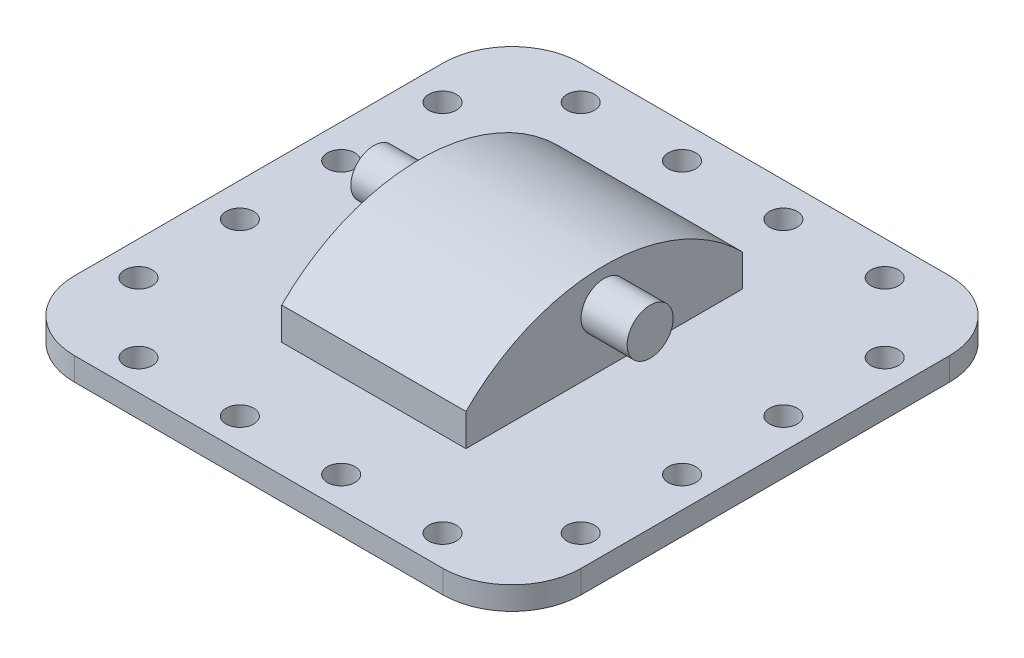
ISO-10303-21;
HEADER;
FILE_DESCRIPTION(('STEP AP214'),'2;1');
FILE_NAME('part.step','',(''),(''),'','','');
FILE_SCHEMA(('AUTOMOTIVE_DESIGN { 1 0 10303 214 1 1 1 1 }'));
ENDSEC;
DATA;
#1=APPLICATION_CONTEXT('core data for automotive mechanical design processes');
#2=APPLICATION_PROTOCOL_DEFINITION('international standard','automotive_design',2000,#1);
#3=PRODUCT_CONTEXT('',#1,'mechanical');
#4=PRODUCT('Part','Part','',(#3));
#5=PRODUCT_RELATED_PRODUCT_CATEGORY('part','',(#4));
#6=PRODUCT_DEFINITION_FORMATION('','',#4);
#7=PRODUCT_DEFINITION_CONTEXT('part definition',#1,'design');
#8=PRODUCT_DEFINITION('design','',#6,#7);
#9=PRODUCT_DEFINITION_SHAPE('','',#8);
#10=(LENGTH_UNIT() NAMED_UNIT(*) SI_UNIT(.MILLI.,.METRE.));
#11=(NAMED_UNIT(*) PLANE_ANGLE_UNIT() SI_UNIT($,.RADIAN.));
#12=(NAMED_UNIT(*) SI_UNIT($,.STERADIAN.) SOLID_ANGLE_UNIT());
#13=UNCERTAINTY_MEASURE_WITH_UNIT(LENGTH_MEASURE(1.E-05),#10,'distance_accuracy_value','');
#14=(GEOMETRIC_REPRESENTATION_CONTEXT(3) GLOBAL_UNCERTAINTY_ASSIGNED_CONTEXT((#13)) GLOBAL_UNIT_ASSIGNED_CONTEXT((#10,
#11,#12)) REPRESENTATION_CONTEXT('',''));
#15=CARTESIAN_POINT('',(0.,0.,0.));
#16=DIRECTION('',(0.,0.,1.));
#17=DIRECTION('',(1.,0.,0.));
#18=AXIS2_PLACEMENT_3D('',#15,#16,#17);
#19=CARTESIAN_POINT('',(0.,5.,0.));
#20=DIRECTION('',(0.,-1.,0.));
#21=DIRECTION('',(0.,0.,-1.));
#22=AXIS2_PLACEMENT_3D('',#19,#20,#21);
#23=PLANE('',#22);
#24=CARTESIAN_POINT('',(48.3346963055934,5.,-10.5816296180082));
#25=DIRECTION('',(0.,-1.,0.));
#26=DIRECTION('',(0.,0.,-1.));
#27=AXIS2_PLACEMENT_3D('',#24,#25,#26);
#28=CIRCLE('',#27,3.00000000000002);
#29=CARTESIAN_POINT('',(48.3346963055934,5.,-13.5816296180082));
#30=VERTEX_POINT('',#29);
#31=EDGE_CURVE('E313',#30,#30,#28,.T.);
#32=ORIENTED_EDGE('',*,*,#31,.T.);
#33=EDGE_LOOP('',(#32));
#34=FACE_BOUND('',#33,.T.);
#35=CARTESIAN_POINT('',(-32.6653036944065,5.,-47.5816296180083));
#36=DIRECTION('',(0.,-1.,0.));
#37=DIRECTION('',(0.,0.,-1.));
#38=AXIS2_PLACEMENT_3D('',#35,#36,#37);
#39=CIRCLE('',#38,3.00000000000001);
#40=CARTESIAN_POINT('',(-32.6653036944065,5.,-50.5816296180083));
#41=VERTEX_POINT('',#40);
#42=EDGE_CURVE('E317',#41,#41,#39,.T.);
#43=ORIENTED_EDGE('',*,*,#42,.T.);
#44=EDGE_LOOP('',(#43));
#45=FACE_BOUND('',#44,.T.);
#46=CARTESIAN_POINT('',(-47.6653036944066,5.,-32.5816296180082));
#47=DIRECTION('',(0.,-1.,0.));
#48=DIRECTION('',(0.,0.,-1.));
#49=AXIS2_PLACEMENT_3D('',#46,#47,#48);
#50=CIRCLE('',#49,3.);
#51=CARTESIAN_POINT('',(-47.6653036944066,5.,-35.5816296180082));
#52=VERTEX_POINT('',#51);
#53=EDGE_CURVE('E321',#52,#52,#50,.T.);
#54=ORIENTED_EDGE('',*,*,#53,.T.);
#55=EDGE_LOOP('',(#54));
#56=FACE_BOUND('',#55,.T.);
#57=CARTESIAN_POINT('',(-47.6653036944066,5.,-10.5816296180082));
#58=DIRECTION('',(0.,-1.,0.));
#59=DIRECTION('',(0.,0.,-1.));
#60=AXIS2_PLACEMENT_3D('',#57,#58,#59);
#61=CIRCLE('',#60,3.00000000000003);
#62=CARTESIAN_POINT('',(-47.6653036944066,5.,-13.5816296180083));
#63=VERTEX_POINT('',#62);
#64=EDGE_CURVE('E325',#63,#63,#61,.T.);
#65=ORIENTED_EDGE('',*,*,#64,.T.);
#66=EDGE_LOOP('',(#65));
#67=FACE_BOUND('',#66,.T.);
#68=CARTESIAN_POINT('',(-47.6653036944066,5.,11.4183703819918));
#69=DIRECTION('',(0.,-1.,0.));
#70=DIRECTION('',(0.,0.,-1.));
#71=AXIS2_PLACEMENT_3D('',#68,#69,#70);
#72=CIRCLE('',#71,2.99999999999997);
#73=CARTESIAN_POINT('',(-47.6653036944066,5.,8.4183703819918));
#74=VERTEX_POINT('',#73);
#75=EDGE_CURVE('E329',#74,#74,#72,.T.);
#76=ORIENTED_EDGE('',*,*,#75,.T.);
#77=EDGE_LOOP('',(#76));
#78=FACE_BOUND('',#77,.T.);
#79=CARTESIAN_POINT('',(-10.6653036944066,5.,48.4183703819918));
#80=DIRECTION('',(0.,-1.,0.));
#81=DIRECTION('',(0.,0.,-1.));
#82=AXIS2_PLACEMENT_3D('',#79,#80,#81);
#83=CIRCLE('',#82,3.00000000000002);
#84=CARTESIAN_POINT('',(-10.6653036944066,5.,45.4183703819917));
#85=VERTEX_POINT('',#84);
#86=EDGE_CURVE('E333',#85,#85,#83,.T.);
#87=ORIENTED_EDGE('',*,*,#86,.T.);
#88=EDGE_LOOP('',(#87));
#89=FACE_BOUND('',#88,.T.);
#90=CARTESIAN_POINT('',(11.3346963055934,5.,48.4183703819918));
#91=DIRECTION('',(0.,-1.,0.));
#92=DIRECTION('',(0.,0.,-1.));
#93=AXIS2_PLACEMENT_3D('',#90,#91,#92);
#94=CIRCLE('',#93,2.99999999999997);
#95=CARTESIAN_POINT('',(11.3346963055934,5.,45.4183703819918));
#96=VERTEX_POINT('',#95);
#97=EDGE_CURVE('E337',#96,#96,#94,.T.);
#98=ORIENTED_EDGE('',*,*,#97,.T.);
#99=EDGE_LOOP('',(#98));
#100=FACE_BOUND('',#99,.T.);
#101=CARTESIAN_POINT('',(33.3346963055934,5.,48.4183703819918));
#102=DIRECTION('',(0.,-1.,0.));
#103=DIRECTION('',(0.,0.,-1.));
#104=AXIS2_PLACEMENT_3D('',#101,#102,#103);
#105=CIRCLE('',#104,3.00000000000001);
#106=CARTESIAN_POINT('',(33.3346963055934,5.,45.4183703819917));
#107=VERTEX_POINT('',#106);
#108=EDGE_CURVE('E341',#107,#107,#105,.T.);
#109=ORIENTED_EDGE('',*,*,#108,.T.);
#110=EDGE_LOOP('',(#109));
#111=FACE_BOUND('',#110,.T.);
#112=CARTESIAN_POINT('',(48.3346963055934,5.,11.4183703819918));
#113=DIRECTION('',(0.,-1.,0.));
#114=DIRECTION('',(0.,0.,-1.));
#115=AXIS2_PLACEMENT_3D('',#112,#113,#114);
#116=CIRCLE('',#115,2.99999999999997);
#117=CARTESIAN_POINT('',(48.3346963055934,5.,8.4183703819918));
#118=VERTEX_POINT('',#117);
#119=EDGE_CURVE('E345',#118,#118,#116,.T.);
#120=ORIENTED_EDGE('',*,*,#119,.T.);
#121=EDGE_LOOP('',(#120));
#122=FACE_BOUND('',#121,.T.);
#123=CARTESIAN_POINT('',(48.3346963055935,5.,-32.5816296180082));
#124=DIRECTION('',(0.,-1.,0.));
#125=DIRECTION('',(0.,0.,-1.));
#126=AXIS2_PLACEMENT_3D('',#123,#124,#125);
#127=CIRCLE('',#126,3.00000000000001);
#128=CARTESIAN_POINT('',(48.3346963055935,5.,-35.5816296180082));
#129=VERTEX_POINT('',#128);
#130=EDGE_CURVE('E349',#129,#129,#127,.T.);
#131=ORIENTED_EDGE('',*,*,#130,.T.);
#132=EDGE_LOOP('',(#131));
#133=FACE_BOUND('',#132,.T.);
#134=CARTESIAN_POINT('',(33.3346963055935,5.,-47.5816296180082));
#135=DIRECTION('',(0.,-1.,0.));
#136=DIRECTION('',(0.,0.,-1.));
#137=AXIS2_PLACEMENT_3D('',#134,#135,#136);
#138=CIRCLE('',#137,2.99999999999997);
#139=CARTESIAN_POINT('',(33.3346963055935,5.,-50.5816296180082));
#140=VERTEX_POINT('',#139);
#141=EDGE_CURVE('E353',#140,#140,#138,.T.);
#142=ORIENTED_EDGE('',*,*,#141,.T.);
#143=EDGE_LOOP('',(#142));
#144=FACE_BOUND('',#143,.T.);
#145=CARTESIAN_POINT('',(11.3346963055935,5.,-47.5816296180082));
#146=DIRECTION('',(0.,-1.,0.));
#147=DIRECTION('',(0.,0.,-1.));
#148=AXIS2_PLACEMENT_3D('',#145,#146,#147);
#149=CIRCLE('',#148,2.99999999999997);
#150=CARTESIAN_POINT('',(11.3346963055935,5.,-50.5816296180082));
#151=VERTEX_POINT('',#150);
#152=EDGE_CURVE('E357',#151,#151,#149,.T.);
#153=ORIENTED_EDGE('',*,*,#152,.T.);
#154=EDGE_LOOP('',(#153));
#155=FACE_BOUND('',#154,.T.);
#156=CARTESIAN_POINT('',(-10.6653036944065,5.,-47.5816296180082));
#157=DIRECTION('',(0.,-1.,0.));
#158=DIRECTION('',(0.,0.,-1.));
#159=AXIS2_PLACEMENT_3D('',#156,#157,#158);
#160=CIRCLE('',#159,3.00000000000002);
#161=CARTESIAN_POINT('',(-10.6653036944065,5.,-50.5816296180083));
#162=VERTEX_POINT('',#161);
#163=EDGE_CURVE('E361',#162,#162,#160,.T.);
#164=ORIENTED_EDGE('',*,*,#163,.T.);
#165=EDGE_LOOP('',(#164));
#166=FACE_BOUND('',#165,.T.);
#167=CARTESIAN_POINT('',(-47.6653036944065,5.,33.4183703819918));
#168=DIRECTION('',(0.,-1.,0.));
#169=DIRECTION('',(0.,0.,-1.));
#170=AXIS2_PLACEMENT_3D('',#167,#168,#169);
#171=CIRCLE('',#170,3.);
#172=CARTESIAN_POINT('',(-47.6653036944065,5.,30.4183703819918));
#173=VERTEX_POINT('',#172);
#174=EDGE_CURVE('E365',#173,#173,#171,.T.);
#175=ORIENTED_EDGE('',*,*,#174,.T.);
#176=EDGE_LOOP('',(#175));
#177=FACE_BOUND('',#176,.T.);
#178=CARTESIAN_POINT('',(-32.6653036944065,5.,48.4183703819918));
#179=DIRECTION('',(0.,-1.,0.));
#180=DIRECTION('',(0.,0.,-1.));
#181=AXIS2_PLACEMENT_3D('',#178,#179,#180);
#182=CIRCLE('',#181,3.00000000000001);
#183=CARTESIAN_POINT('',(-32.6653036944065,5.,45.4183703819918));
#184=VERTEX_POINT('',#183);
#185=EDGE_CURVE('E369',#184,#184,#182,.T.);
#186=ORIENTED_EDGE('',*,*,#185,.T.);
#187=EDGE_LOOP('',(#186));
#188=FACE_BOUND('',#187,.T.);
#189=CARTESIAN_POINT('',(48.3346963055934,5.,33.4183703819918));
#190=DIRECTION('',(0.,-1.,0.));
#191=DIRECTION('',(0.,0.,-1.));
#192=AXIS2_PLACEMENT_3D('',#189,#190,#191);
#193=CIRCLE('',#192,3.00000000000001);
#194=CARTESIAN_POINT('',(48.3346963055934,5.,30.4183703819918));
#195=VERTEX_POINT('',#194);
#196=EDGE_CURVE('E373',#195,#195,#193,.T.);
#197=ORIENTED_EDGE('',*,*,#196,.T.);
#198=EDGE_LOOP('',(#197));
#199=FACE_BOUND('',#198,.T.);
#200=DIRECTION('',(1.,0.,0.));
#201=VECTOR('',#200,1.);
#202=CARTESIAN_POINT('',(-55.,5.,55.));
#203=LINE('',#202,#201);
#204=CARTESIAN_POINT('',(-40.,5.,55.));
#205=VERTEX_POINT('',#204);
#206=CARTESIAN_POINT('',(40.,5.,55.));
#207=VERTEX_POINT('',#206);
#208=EDGE_CURVE('E174',#205,#207,#203,.T.);
#209=ORIENTED_EDGE('',*,*,#208,.T.);
#210=CARTESIAN_POINT('',(40.,5.,40.));
#211=DIRECTION('',(0.,-1.,0.));
#212=DIRECTION('',(0.,0.,-1.));
#213=AXIS2_PLACEMENT_3D('',#210,#211,#212);
#214=CIRCLE('',#213,15.);
#215=CARTESIAN_POINT('',(55.,5.,40.));
#216=VERTEX_POINT('',#215);
#217=EDGE_CURVE('E11',#207,#216,#214,.F.);
#218=ORIENTED_EDGE('',*,*,#217,.T.);
#219=DIRECTION('',(0.,0.,-1.));
#220=VECTOR('',#219,1.);
#221=CARTESIAN_POINT('',(55.,5.,55.));
#222=LINE('',#221,#220);
#223=CARTESIAN_POINT('',(55.,5.,-40.));
#224=VERTEX_POINT('',#223);
#225=EDGE_CURVE('E162',#216,#224,#222,.T.);
#226=ORIENTED_EDGE('',*,*,#225,.T.);
#227=CARTESIAN_POINT('',(40.,5.,-40.));
#228=DIRECTION('',(0.,-1.,0.));
#229=DIRECTION('',(0.,0.,-1.));
#230=AXIS2_PLACEMENT_3D('',#227,#228,#229);
#231=CIRCLE('',#230,15.);
#232=CARTESIAN_POINT('',(40.,5.,-55.));
#233=VERTEX_POINT('',#232);
#234=EDGE_CURVE('E200',#224,#233,#231,.F.);
#235=ORIENTED_EDGE('',*,*,#234,.T.);
#236=DIRECTION('',(-1.,0.,0.));
#237=VECTOR('',#236,1.);
#238=CARTESIAN_POINT('',(-55.,5.,-55.));
#239=LINE('',#238,#237);
#240=CARTESIAN_POINT('',(-40.,5.,-55.));
#241=VERTEX_POINT('',#240);
#242=EDGE_CURVE('E165',#233,#241,#239,.T.);
#243=ORIENTED_EDGE('',*,*,#242,.T.);
#244=CARTESIAN_POINT('',(-40.,5.,-40.));
#245=DIRECTION('',(0.,-1.,0.));
#246=DIRECTION('',(0.,0.,-1.));
#247=AXIS2_PLACEMENT_3D('',#244,#245,#246);
#248=CIRCLE('',#247,15.);
#249=CARTESIAN_POINT('',(-55.,5.,-40.));
#250=VERTEX_POINT('',#249);
#251=EDGE_CURVE('E214',#241,#250,#248,.F.);
#252=ORIENTED_EDGE('',*,*,#251,.T.);
#253=DIRECTION('',(0.,0.,1.));
#254=VECTOR('',#253,1.);
#255=CARTESIAN_POINT('',(-55.,5.,55.));
#256=LINE('',#255,#254);
#257=CARTESIAN_POINT('',(-55.,5.,40.));
#258=VERTEX_POINT('',#257);
#259=EDGE_CURVE('E170',#250,#258,#256,.T.);
#260=ORIENTED_EDGE('',*,*,#259,.T.);
#261=CARTESIAN_POINT('',(-40.,5.,40.));
#262=DIRECTION('',(0.,-1.,0.));
#263=DIRECTION('',(0.,0.,-1.));
#264=AXIS2_PLACEMENT_3D('',#261,#262,#263);
#265=CIRCLE('',#264,15.);
#266=EDGE_CURVE('E228',#258,#205,#265,.F.);
#267=ORIENTED_EDGE('',*,*,#266,.T.);
#268=EDGE_LOOP('',(#209,#218,#226,#235,#243,#252,#260,#267));
#269=FACE_BOUND('',#268,.T.);
#270=DIRECTION('',(0.,0.,-1.));
#271=VECTOR('',#270,1.);
#272=CARTESIAN_POINT('',(20.,5.,30.));
#273=LINE('',#272,#271);
#274=CARTESIAN_POINT('',(20.,5.,30.));
#275=VERTEX_POINT('',#274);
#276=CARTESIAN_POINT('',(20.,5.,-30.));
#277=VERTEX_POINT('',#276);
#278=EDGE_CURVE('E150',#275,#277,#273,.T.);
#279=ORIENTED_EDGE('',*,*,#278,.F.);
#280=DIRECTION('',(1.,0.,0.));
#281=VECTOR('',#280,1.);
#282=CARTESIAN_POINT('',(-20.,5.,30.));
#283=LINE('',#282,#281);
#284=CARTESIAN_POINT('',(-20.,5.,30.));
#285=VERTEX_POINT('',#284);
#286=EDGE_CURVE('E282',#285,#275,#283,.T.);
#287=ORIENTED_EDGE('',*,*,#286,.F.);
#288=DIRECTION('',(0.,0.,1.));
#289=VECTOR('',#288,1.);
#290=CARTESIAN_POINT('',(-20.,5.,30.));
#291=LINE('',#290,#289);
#292=CARTESIAN_POINT('',(-20.,5.,-30.));
#293=VERTEX_POINT('',#292);
#294=EDGE_CURVE('E292',#293,#285,#291,.T.);
#295=ORIENTED_EDGE('',*,*,#294,.F.);
#296=DIRECTION('',(-1.,0.,0.));
#297=VECTOR('',#296,1.);
#298=CARTESIAN_POINT('',(-20.,5.,-30.));
#299=LINE('',#298,#297);
#300=EDGE_CURVE('E284',#277,#293,#299,.T.);
#301=ORIENTED_EDGE('',*,*,#300,.F.);
#302=EDGE_LOOP('',(#279,#287,#295,#301));
#303=FACE_BOUND('',#302,.T.);
#304=ADVANCED_FACE('F43',(#34,#45,#56,#67,#78,#89,#100,#111,#122,#133,#144,#155,#166,#177,#188,
#199,#269,#303),#23,.F.);
#305=CARTESIAN_POINT('',(40.,5.,40.));
#306=DIRECTION('',(0.,1.,0.));
#307=DIRECTION('',(0.,0.,1.));
#308=AXIS2_PLACEMENT_3D('',#305,#306,#307);
#309=CYLINDRICAL_SURFACE('',#308,15.);
#310=DIRECTION('',(0.,1.,0.));
#311=VECTOR('',#310,1.);
#312=CARTESIAN_POINT('',(40.,5.,55.));
#313=LINE('',#312,#311);
#314=CARTESIAN_POINT('',(40.,0.,55.));
#315=VERTEX_POINT('',#314);
#316=EDGE_CURVE('E231',#315,#207,#313,.T.);
#317=ORIENTED_EDGE('',*,*,#316,.F.);
#318=CARTESIAN_POINT('',(40.,0.,40.));
#319=DIRECTION('',(0.,-1.,0.));
#320=DIRECTION('',(0.,0.,-1.));
#321=AXIS2_PLACEMENT_3D('',#318,#319,#320);
#322=CIRCLE('',#321,15.);
#323=CARTESIAN_POINT('',(55.,0.,40.));
#324=VERTEX_POINT('',#323);
#325=EDGE_CURVE('E53',#324,#315,#322,.T.);
#326=ORIENTED_EDGE('',*,*,#325,.F.);
#327=DIRECTION('',(0.,1.,0.));
#328=VECTOR('',#327,1.);
#329=CARTESIAN_POINT('',(55.,5.,40.));
#330=LINE('',#329,#328);
#331=EDGE_CURVE('E235',#216,#324,#330,.F.);
#332=ORIENTED_EDGE('',*,*,#331,.F.);
#333=ORIENTED_EDGE('',*,*,#217,.F.);
#334=EDGE_LOOP('',(#317,#326,#332,#333));
#335=FACE_BOUND('',#334,.T.);
#336=ADVANCED_FACE('F45',(#335),#309,.T.);
#337=CARTESIAN_POINT('',(-40.,5.,40.));
#338=DIRECTION('',(0.,1.,0.));
#339=DIRECTION('',(0.,0.,1.));
#340=AXIS2_PLACEMENT_3D('',#337,#338,#339);
#341=CYLINDRICAL_SURFACE('',#340,15.);
#342=DIRECTION('',(0.,1.,0.));
#343=VECTOR('',#342,1.);
#344=CARTESIAN_POINT('',(-55.,5.,40.));
#345=LINE('',#344,#343);
#346=CARTESIAN_POINT('',(-55.,0.,40.));
#347=VERTEX_POINT('',#346);
#348=EDGE_CURVE('E217',#347,#258,#345,.T.);
#349=ORIENTED_EDGE('',*,*,#348,.F.);
#350=CARTESIAN_POINT('',(-40.,0.,40.));
#351=DIRECTION('',(0.,-1.,0.));
#352=DIRECTION('',(0.,0.,-1.));
#353=AXIS2_PLACEMENT_3D('',#350,#351,#352);
#354=CIRCLE('',#353,15.);
#355=CARTESIAN_POINT('',(-40.,0.,55.));
#356=VERTEX_POINT('',#355);
#357=EDGE_CURVE('E225',#356,#347,#354,.T.);
#358=ORIENTED_EDGE('',*,*,#357,.F.);
#359=DIRECTION('',(0.,1.,0.));
#360=VECTOR('',#359,1.);
#361=CARTESIAN_POINT('',(-40.,5.,55.));
#362=LINE('',#361,#360);
#363=EDGE_CURVE('E221',#205,#356,#362,.F.);
#364=ORIENTED_EDGE('',*,*,#363,.F.);
#365=ORIENTED_EDGE('',*,*,#266,.F.);
#366=EDGE_LOOP('',(#349,#358,#364,#365));
#367=FACE_BOUND('',#366,.T.);
#368=ADVANCED_FACE('F253',(#367),#341,.T.);
#369=CARTESIAN_POINT('',(-40.,5.,-40.));
#370=DIRECTION('',(0.,1.,0.));
#371=DIRECTION('',(0.,0.,1.));
#372=AXIS2_PLACEMENT_3D('',#369,#370,#371);
#373=CYLINDRICAL_SURFACE('',#372,15.);
#374=DIRECTION('',(0.,1.,0.));
#375=VECTOR('',#374,1.);
#376=CARTESIAN_POINT('',(-40.,5.,-55.));
#377=LINE('',#376,#375);
#378=CARTESIAN_POINT('',(-40.,0.,-55.));
#379=VERTEX_POINT('',#378);
#380=EDGE_CURVE('E203',#379,#241,#377,.T.);
#381=ORIENTED_EDGE('',*,*,#380,.F.);
#382=CARTESIAN_POINT('',(-40.,0.,-40.));
#383=DIRECTION('',(0.,-1.,0.));
#384=DIRECTION('',(0.,0.,-1.));
#385=AXIS2_PLACEMENT_3D('',#382,#383,#384);
#386=CIRCLE('',#385,15.);
#387=CARTESIAN_POINT('',(-55.,0.,-40.));
#388=VERTEX_POINT('',#387);
#389=EDGE_CURVE('E211',#388,#379,#386,.T.);
#390=ORIENTED_EDGE('',*,*,#389,.F.);
#391=DIRECTION('',(0.,1.,0.));
#392=VECTOR('',#391,1.);
#393=CARTESIAN_POINT('',(-55.,5.,-40.));
#394=LINE('',#393,#392);
#395=EDGE_CURVE('E207',#250,#388,#394,.F.);
#396=ORIENTED_EDGE('',*,*,#395,.F.);
#397=ORIENTED_EDGE('',*,*,#251,.F.);
#398=EDGE_LOOP('',(#381,#390,#396,#397));
#399=FACE_BOUND('',#398,.T.);
#400=ADVANCED_FACE('F262',(#399),#373,.T.);
#401=CARTESIAN_POINT('',(40.,5.,-40.));
#402=DIRECTION('',(0.,1.,0.));
#403=DIRECTION('',(0.,0.,1.));
#404=AXIS2_PLACEMENT_3D('',#401,#402,#403);
#405=CYLINDRICAL_SURFACE('',#404,15.);
#406=DIRECTION('',(0.,1.,0.));
#407=VECTOR('',#406,1.);
#408=CARTESIAN_POINT('',(55.,5.,-40.));
#409=LINE('',#408,#407);
#410=CARTESIAN_POINT('',(55.,0.,-40.));
#411=VERTEX_POINT('',#410);
#412=EDGE_CURVE('E177',#411,#224,#409,.T.);
#413=ORIENTED_EDGE('',*,*,#412,.F.);
#414=CARTESIAN_POINT('',(40.,0.,-40.));
#415=DIRECTION('',(0.,-1.,0.));
#416=DIRECTION('',(0.,0.,-1.));
#417=AXIS2_PLACEMENT_3D('',#414,#415,#416);
#418=CIRCLE('',#417,15.);
#419=CARTESIAN_POINT('',(40.,0.,-55.));
#420=VERTEX_POINT('',#419);
#421=EDGE_CURVE('E196',#420,#411,#418,.T.);
#422=ORIENTED_EDGE('',*,*,#421,.F.);
#423=DIRECTION('',(0.,1.,0.));
#424=VECTOR('',#423,1.);
#425=CARTESIAN_POINT('',(40.,5.,-55.));
#426=LINE('',#425,#424);
#427=EDGE_CURVE('E192',#233,#420,#426,.F.);
#428=ORIENTED_EDGE('',*,*,#427,.F.);
#429=ORIENTED_EDGE('',*,*,#234,.F.);
#430=EDGE_LOOP('',(#413,#422,#428,#429));
#431=FACE_BOUND('',#430,.T.);
#432=ADVANCED_FACE('F270',(#431),#405,.T.);
#433=CARTESIAN_POINT('',(55.,5.,55.));
#434=DIRECTION('',(-1.,0.,0.));
#435=DIRECTION('',(0.,0.,1.));
#436=AXIS2_PLACEMENT_3D('',#433,#434,#435);
#437=PLANE('',#436);
#438=ORIENTED_EDGE('',*,*,#225,.F.);
#439=ORIENTED_EDGE('',*,*,#331,.T.);
#440=DIRECTION('',(0.,0.,-1.));
#441=VECTOR('',#440,1.);
#442=CARTESIAN_POINT('',(55.,0.,55.));
#443=LINE('',#442,#441);
#444=EDGE_CURVE('E152',#324,#411,#443,.T.);
#445=ORIENTED_EDGE('',*,*,#444,.T.);
#446=ORIENTED_EDGE('',*,*,#412,.T.);
#447=EDGE_LOOP('',(#438,#439,#445,#446));
#448=FACE_BOUND('',#447,.T.);
#449=ADVANCED_FACE('F273',(#448),#437,.F.);
#450=CARTESIAN_POINT('',(-55.,5.,-55.));
#451=DIRECTION('',(0.,0.,1.));
#452=DIRECTION('',(1.,0.,0.));
#453=AXIS2_PLACEMENT_3D('',#450,#451,#452);
#454=PLANE('',#453);
#455=DIRECTION('',(-1.,0.,0.));
#456=VECTOR('',#455,1.);
#457=CARTESIAN_POINT('',(-55.,0.,-55.));
#458=LINE('',#457,#456);
#459=EDGE_CURVE('E156',#420,#379,#458,.T.);
#460=ORIENTED_EDGE('',*,*,#459,.T.);
#461=ORIENTED_EDGE('',*,*,#380,.T.);
#462=ORIENTED_EDGE('',*,*,#242,.F.);
#463=ORIENTED_EDGE('',*,*,#427,.T.);
#464=EDGE_LOOP('',(#460,#461,#462,#463));
#465=FACE_BOUND('',#464,.T.);
#466=ADVANCED_FACE('F265',(#465),#454,.F.);
#467=CARTESIAN_POINT('',(-55.,5.,55.));
#468=DIRECTION('',(1.,0.,0.));
#469=DIRECTION('',(0.,0.,-1.));
#470=AXIS2_PLACEMENT_3D('',#467,#468,#469);
#471=PLANE('',#470);
#472=DIRECTION('',(0.,0.,1.));
#473=VECTOR('',#472,1.);
#474=CARTESIAN_POINT('',(-55.,0.,55.));
#475=LINE('',#474,#473);
#476=EDGE_CURVE('E182',#388,#347,#475,.T.);
#477=ORIENTED_EDGE('',*,*,#476,.T.);
#478=ORIENTED_EDGE('',*,*,#348,.T.);
#479=ORIENTED_EDGE('',*,*,#259,.F.);
#480=ORIENTED_EDGE('',*,*,#395,.T.);
#481=EDGE_LOOP('',(#477,#478,#479,#480));
#482=FACE_BOUND('',#481,.T.);
#483=ADVANCED_FACE('F258',(#482),#471,.F.);
#484=CARTESIAN_POINT('',(-55.,5.,55.));
#485=DIRECTION('',(0.,0.,-1.));
#486=DIRECTION('',(-1.,0.,0.));
#487=AXIS2_PLACEMENT_3D('',#484,#485,#486);
#488=PLANE('',#487);
#489=DIRECTION('',(1.,0.,0.));
#490=VECTOR('',#489,1.);
#491=CARTESIAN_POINT('',(-55.,0.,55.));
#492=LINE('',#491,#490);
#493=EDGE_CURVE('E166',#356,#315,#492,.T.);
#494=ORIENTED_EDGE('',*,*,#493,.T.);
#495=ORIENTED_EDGE('',*,*,#316,.T.);
#496=ORIENTED_EDGE('',*,*,#208,.F.);
#497=ORIENTED_EDGE('',*,*,#363,.T.);
#498=EDGE_LOOP('',(#494,#495,#496,#497));
#499=FACE_BOUND('',#498,.T.);
#500=ADVANCED_FACE('F249',(#499),#488,.F.);
#501=CARTESIAN_POINT('',(0.,0.,0.));
#502=DIRECTION('',(0.,-1.,0.));
#503=DIRECTION('',(0.,0.,-1.));
#504=AXIS2_PLACEMENT_3D('',#501,#502,#503);
#505=PLANE('',#504);
#506=CARTESIAN_POINT('',(48.3346963055934,0.,-10.5816296180082));
#507=DIRECTION('',(0.,-1.,0.));
#508=DIRECTION('',(0.,0.,-1.));
#509=AXIS2_PLACEMENT_3D('',#506,#507,#508);
#510=CIRCLE('',#509,3.00000000000002);
#511=CARTESIAN_POINT('',(48.3346963055934,0.,-13.5816296180082));
#512=VERTEX_POINT('',#511);
#513=EDGE_CURVE('E381',#512,#512,#510,.T.);
#514=ORIENTED_EDGE('',*,*,#513,.F.);
#515=EDGE_LOOP('',(#514));
#516=FACE_BOUND('',#515,.T.);
#517=CARTESIAN_POINT('',(-32.6653036944065,0.,-47.5816296180083));
#518=DIRECTION('',(0.,-1.,0.));
#519=DIRECTION('',(0.,0.,-1.));
#520=AXIS2_PLACEMENT_3D('',#517,#518,#519);
#521=CIRCLE('',#520,3.00000000000001);
#522=CARTESIAN_POINT('',(-32.6653036944065,0.,-50.5816296180083));
#523=VERTEX_POINT('',#522);
#524=EDGE_CURVE('E407',#523,#523,#521,.T.);
#525=ORIENTED_EDGE('',*,*,#524,.F.);
#526=EDGE_LOOP('',(#525));
#527=FACE_BOUND('',#526,.T.);
#528=CARTESIAN_POINT('',(-47.6653036944066,0.,-32.5816296180082));
#529=DIRECTION('',(0.,-1.,0.));
#530=DIRECTION('',(0.,0.,-1.));
#531=AXIS2_PLACEMENT_3D('',#528,#529,#530);
#532=CIRCLE('',#531,3.);
#533=CARTESIAN_POINT('',(-47.6653036944066,0.,-35.5816296180082));
#534=VERTEX_POINT('',#533);
#535=EDGE_CURVE('E403',#534,#534,#532,.T.);
#536=ORIENTED_EDGE('',*,*,#535,.F.);
#537=EDGE_LOOP('',(#536));
#538=FACE_BOUND('',#537,.T.);
#539=CARTESIAN_POINT('',(-47.6653036944066,0.,-10.5816296180082));
#540=DIRECTION('',(0.,-1.,0.));
#541=DIRECTION('',(0.,0.,-1.));
#542=AXIS2_PLACEMENT_3D('',#539,#540,#541);
#543=CIRCLE('',#542,3.00000000000003);
#544=CARTESIAN_POINT('',(-47.6653036944066,0.,-13.5816296180083));
#545=VERTEX_POINT('',#544);
#546=EDGE_CURVE('E399',#545,#545,#543,.T.);
#547=ORIENTED_EDGE('',*,*,#546,.F.);
#548=EDGE_LOOP('',(#547));
#549=FACE_BOUND('',#548,.T.);
#550=CARTESIAN_POINT('',(-47.6653036944066,0.,11.4183703819918));
#551=DIRECTION('',(0.,-1.,0.));
#552=DIRECTION('',(0.,0.,-1.));
#553=AXIS2_PLACEMENT_3D('',#550,#551,#552);
#554=CIRCLE('',#553,2.99999999999997);
#555=CARTESIAN_POINT('',(-47.6653036944066,0.,8.4183703819918));
#556=VERTEX_POINT('',#555);
#557=EDGE_CURVE('E395',#556,#556,#554,.T.);
#558=ORIENTED_EDGE('',*,*,#557,.F.);
#559=EDGE_LOOP('',(#558));
#560=FACE_BOUND('',#559,.T.);
#561=CARTESIAN_POINT('',(-10.6653036944066,0.,48.4183703819918));
#562=DIRECTION('',(0.,-1.,0.));
#563=DIRECTION('',(0.,0.,-1.));
#564=AXIS2_PLACEMENT_3D('',#561,#562,#563);
#565=CIRCLE('',#564,3.00000000000002);
#566=CARTESIAN_POINT('',(-10.6653036944066,0.,45.4183703819917));
#567=VERTEX_POINT('',#566);
#568=EDGE_CURVE('E391',#567,#567,#565,.T.);
#569=ORIENTED_EDGE('',*,*,#568,.F.);
#570=EDGE_LOOP('',(#569));
#571=FACE_BOUND('',#570,.T.);
#572=CARTESIAN_POINT('',(11.3346963055934,0.,48.4183703819918));
#573=DIRECTION('',(0.,-1.,0.));
#574=DIRECTION('',(0.,0.,-1.));
#575=AXIS2_PLACEMENT_3D('',#572,#573,#574);
#576=CIRCLE('',#575,2.99999999999997);
#577=CARTESIAN_POINT('',(11.3346963055934,0.,45.4183703819918));
#578=VERTEX_POINT('',#577);
#579=EDGE_CURVE('E386',#578,#578,#576,.T.);
#580=ORIENTED_EDGE('',*,*,#579,.F.);
#581=EDGE_LOOP('',(#580));
#582=FACE_BOUND('',#581,.T.);
#583=CARTESIAN_POINT('',(33.3346963055934,0.,48.4183703819918));
#584=DIRECTION('',(0.,-1.,0.));
#585=DIRECTION('',(0.,0.,-1.));
#586=AXIS2_PLACEMENT_3D('',#583,#584,#585);
#587=CIRCLE('',#586,3.00000000000001);
#588=CARTESIAN_POINT('',(33.3346963055934,0.,45.4183703819917));
#589=VERTEX_POINT('',#588);
#590=EDGE_CURVE('E382',#589,#589,#587,.T.);
#591=ORIENTED_EDGE('',*,*,#590,.F.);
#592=EDGE_LOOP('',(#591));
#593=FACE_BOUND('',#592,.T.);
#594=CARTESIAN_POINT('',(48.3346963055934,0.,11.4183703819918));
#595=DIRECTION('',(0.,-1.,0.));
#596=DIRECTION('',(0.,0.,-1.));
#597=AXIS2_PLACEMENT_3D('',#594,#595,#596);
#598=CIRCLE('',#597,2.99999999999997);
#599=CARTESIAN_POINT('',(48.3346963055934,0.,8.4183703819918));
#600=VERTEX_POINT('',#599);
#601=EDGE_CURVE('E387',#600,#600,#598,.T.);
#602=ORIENTED_EDGE('',*,*,#601,.F.);
#603=EDGE_LOOP('',(#602));
#604=FACE_BOUND('',#603,.T.);
#605=CARTESIAN_POINT('',(48.3346963055935,0.,-32.5816296180082));
#606=DIRECTION('',(0.,-1.,0.));
#607=DIRECTION('',(0.,0.,-1.));
#608=AXIS2_PLACEMENT_3D('',#605,#606,#607);
#609=CIRCLE('',#608,3.00000000000001);
#610=CARTESIAN_POINT('',(48.3346963055935,0.,-35.5816296180082));
#611=VERTEX_POINT('',#610);
#612=EDGE_CURVE('E434',#611,#611,#609,.T.);
#613=ORIENTED_EDGE('',*,*,#612,.F.);
#614=EDGE_LOOP('',(#613));
#615=FACE_BOUND('',#614,.T.);
#616=CARTESIAN_POINT('',(33.3346963055935,0.,-47.5816296180082));
#617=DIRECTION('',(0.,-1.,0.));
#618=DIRECTION('',(0.,0.,-1.));
#619=AXIS2_PLACEMENT_3D('',#616,#617,#618);
#620=CIRCLE('',#619,2.99999999999997);
#621=CARTESIAN_POINT('',(33.3346963055935,0.,-50.5816296180082));
#622=VERTEX_POINT('',#621);
#623=EDGE_CURVE('E430',#622,#622,#620,.T.);
#624=ORIENTED_EDGE('',*,*,#623,.F.);
#625=EDGE_LOOP('',(#624));
#626=FACE_BOUND('',#625,.T.);
#627=CARTESIAN_POINT('',(11.3346963055935,0.,-47.5816296180082));
#628=DIRECTION('',(0.,-1.,0.));
#629=DIRECTION('',(0.,0.,-1.));
#630=AXIS2_PLACEMENT_3D('',#627,#628,#629);
#631=CIRCLE('',#630,2.99999999999997);
#632=CARTESIAN_POINT('',(11.3346963055935,0.,-50.5816296180082));
#633=VERTEX_POINT('',#632);
#634=EDGE_CURVE('E426',#633,#633,#631,.T.);
#635=ORIENTED_EDGE('',*,*,#634,.F.);
#636=EDGE_LOOP('',(#635));
#637=FACE_BOUND('',#636,.T.);
#638=CARTESIAN_POINT('',(-10.6653036944065,0.,-47.5816296180082));
#639=DIRECTION('',(0.,-1.,0.));
#640=DIRECTION('',(0.,0.,-1.));
#641=AXIS2_PLACEMENT_3D('',#638,#639,#640);
#642=CIRCLE('',#641,3.00000000000002);
#643=CARTESIAN_POINT('',(-10.6653036944065,0.,-50.5816296180083));
#644=VERTEX_POINT('',#643);
#645=EDGE_CURVE('E422',#644,#644,#642,.T.);
#646=ORIENTED_EDGE('',*,*,#645,.F.);
#647=EDGE_LOOP('',(#646));
#648=FACE_BOUND('',#647,.T.);
#649=CARTESIAN_POINT('',(-47.6653036944065,0.,33.4183703819918));
#650=DIRECTION('',(0.,-1.,0.));
#651=DIRECTION('',(0.,0.,-1.));
#652=AXIS2_PLACEMENT_3D('',#649,#650,#651);
#653=CIRCLE('',#652,3.);
#654=CARTESIAN_POINT('',(-47.6653036944065,0.,30.4183703819918));
#655=VERTEX_POINT('',#654);
#656=EDGE_CURVE('E418',#655,#655,#653,.T.);
#657=ORIENTED_EDGE('',*,*,#656,.F.);
#658=EDGE_LOOP('',(#657));
#659=FACE_BOUND('',#658,.T.);
#660=CARTESIAN_POINT('',(-32.6653036944065,0.,48.4183703819918));
#661=DIRECTION('',(0.,-1.,0.));
#662=DIRECTION('',(0.,0.,-1.));
#663=AXIS2_PLACEMENT_3D('',#660,#661,#662);
#664=CIRCLE('',#663,3.00000000000001);
#665=CARTESIAN_POINT('',(-32.6653036944065,0.,45.4183703819918));
#666=VERTEX_POINT('',#665);
#667=EDGE_CURVE('E414',#666,#666,#664,.T.);
#668=ORIENTED_EDGE('',*,*,#667,.F.);
#669=EDGE_LOOP('',(#668));
#670=FACE_BOUND('',#669,.T.);
#671=CARTESIAN_POINT('',(48.3346963055934,0.,33.4183703819918));
#672=DIRECTION('',(0.,-1.,0.));
#673=DIRECTION('',(0.,0.,-1.));
#674=AXIS2_PLACEMENT_3D('',#671,#672,#673);
#675=CIRCLE('',#674,3.00000000000001);
#676=CARTESIAN_POINT('',(48.3346963055934,0.,30.4183703819918));
#677=VERTEX_POINT('',#676);
#678=EDGE_CURVE('E377',#677,#677,#675,.T.);
#679=ORIENTED_EDGE('',*,*,#678,.F.);
#680=EDGE_LOOP('',(#679));
#681=FACE_BOUND('',#680,.T.);
#682=ORIENTED_EDGE('',*,*,#444,.F.);
#683=ORIENTED_EDGE('',*,*,#325,.T.);
#684=ORIENTED_EDGE('',*,*,#493,.F.);
#685=ORIENTED_EDGE('',*,*,#357,.T.);
#686=ORIENTED_EDGE('',*,*,#476,.F.);
#687=ORIENTED_EDGE('',*,*,#389,.T.);
#688=ORIENTED_EDGE('',*,*,#459,.F.);
#689=ORIENTED_EDGE('',*,*,#421,.T.);
#690=EDGE_LOOP('',(#682,#683,#684,#685,#686,#687,#688,#689));
#691=FACE_BOUND('',#690,.T.);
#692=ADVANCED_FACE('F244',(#516,#527,#538,#549,#560,#571,#582,#593,#604,#615,#626,#637,#648,
#659,#670,#681,#691),#505,.T.);
#693=CARTESIAN_POINT('',(20.,29.,30.));
#694=DIRECTION('',(-1.,0.,0.));
#695=DIRECTION('',(0.,0.,1.));
#696=AXIS2_PLACEMENT_3D('',#693,#694,#695);
#697=PLANE('',#696);
#698=CARTESIAN_POINT('',(20.,17.,0.));
#699=DIRECTION('',(-1.,0.,0.));
#700=DIRECTION('',(0.,0.,1.));
#701=AXIS2_PLACEMENT_3D('',#698,#699,#700);
#702=CIRCLE('',#701,5.);
#703=CARTESIAN_POINT('',(20.,17.,5.));
#704=VERTEX_POINT('',#703);
#705=EDGE_CURVE('E286',#704,#704,#702,.T.);
#706=ORIENTED_EDGE('',*,*,#705,.T.);
#707=EDGE_LOOP('',(#706));
#708=FACE_BOUND('',#707,.T.);
#709=DIRECTION('',(0.,-1.,0.));
#710=VECTOR('',#709,1.);
#711=CARTESIAN_POINT('',(20.,29.,-30.));
#712=LINE('',#711,#710);
#713=CARTESIAN_POINT('',(20.,12.,-30.));
#714=VERTEX_POINT('',#713);
#715=EDGE_CURVE('E144',#714,#277,#712,.T.);
#716=ORIENTED_EDGE('',*,*,#715,.F.);
#717=CARTESIAN_POINT('',(20.,-18.,0.));
#718=DIRECTION('',(-1.,0.,0.));
#719=DIRECTION('',(0.,0.,1.));
#720=AXIS2_PLACEMENT_3D('',#717,#718,#719);
#721=CIRCLE('',#720,42.4264068711928);
#722=CARTESIAN_POINT('',(20.,12.,30.));
#723=VERTEX_POINT('',#722);
#724=EDGE_CURVE('E132',#723,#714,#721,.T.);
#725=ORIENTED_EDGE('',*,*,#724,.F.);
#726=DIRECTION('',(0.,-1.,0.));
#727=VECTOR('',#726,1.);
#728=CARTESIAN_POINT('',(20.,29.,30.));
#729=LINE('',#728,#727);
#730=EDGE_CURVE('E68',#723,#275,#729,.T.);
#731=ORIENTED_EDGE('',*,*,#730,.T.);
#732=ORIENTED_EDGE('',*,*,#278,.T.);
#733=EDGE_LOOP('',(#716,#725,#731,#732));
#734=FACE_BOUND('',#733,.T.);
#735=ADVANCED_FACE('F149',(#708,#734),#697,.F.);
#736=CARTESIAN_POINT('',(-20.,29.,-30.));
#737=DIRECTION('',(0.,0.,1.));
#738=DIRECTION('',(1.,0.,0.));
#739=AXIS2_PLACEMENT_3D('',#736,#737,#738);
#740=PLANE('',#739);
#741=DIRECTION('',(0.,-1.,0.));
#742=VECTOR('',#741,1.);
#743=CARTESIAN_POINT('',(-20.,29.,-30.));
#744=LINE('',#743,#742);
#745=CARTESIAN_POINT('',(-20.,12.,-30.));
#746=VERTEX_POINT('',#745);
#747=EDGE_CURVE('E146',#746,#293,#744,.T.);
#748=ORIENTED_EDGE('',*,*,#747,.F.);
#749=DIRECTION('',(1.,0.,0.));
#750=VECTOR('',#749,1.);
#751=CARTESIAN_POINT('',(-40.,12.,-30.));
#752=LINE('',#751,#750);
#753=EDGE_CURVE('E135',#746,#714,#752,.T.);
#754=ORIENTED_EDGE('',*,*,#753,.T.);
#755=ORIENTED_EDGE('',*,*,#715,.T.);
#756=ORIENTED_EDGE('',*,*,#300,.T.);
#757=EDGE_LOOP('',(#748,#754,#755,#756));
#758=FACE_BOUND('',#757,.T.);
#759=ADVANCED_FACE('F142',(#758),#740,.F.);
#760=CARTESIAN_POINT('',(-20.,29.,30.));
#761=DIRECTION('',(1.,0.,0.));
#762=DIRECTION('',(0.,0.,-1.));
#763=AXIS2_PLACEMENT_3D('',#760,#761,#762);
#764=PLANE('',#763);
#765=CARTESIAN_POINT('',(-20.,17.,0.));
#766=DIRECTION('',(1.,0.,0.));
#767=DIRECTION('',(0.,0.,-1.));
#768=AXIS2_PLACEMENT_3D('',#765,#766,#767);
#769=CIRCLE('',#768,5.);
#770=CARTESIAN_POINT('',(-20.,17.,-5.));
#771=VERTEX_POINT('',#770);
#772=EDGE_CURVE('E47',#771,#771,#769,.T.);
#773=ORIENTED_EDGE('',*,*,#772,.T.);
#774=EDGE_LOOP('',(#773));
#775=FACE_BOUND('',#774,.T.);
#776=DIRECTION('',(0.,-1.,0.));
#777=VECTOR('',#776,1.);
#778=CARTESIAN_POINT('',(-20.,29.,30.));
#779=LINE('',#778,#777);
#780=CARTESIAN_POINT('',(-20.,12.,30.));
#781=VERTEX_POINT('',#780);
#782=EDGE_CURVE('E158',#781,#285,#779,.T.);
#783=ORIENTED_EDGE('',*,*,#782,.F.);
#784=CARTESIAN_POINT('',(-20.,-18.,0.));
#785=DIRECTION('',(1.,0.,0.));
#786=DIRECTION('',(0.,0.,-1.));
#787=AXIS2_PLACEMENT_3D('',#784,#785,#786);
#788=CIRCLE('',#787,42.4264068711928);
#789=EDGE_CURVE('E60',#781,#746,#788,.F.);
#790=ORIENTED_EDGE('',*,*,#789,.T.);
#791=ORIENTED_EDGE('',*,*,#747,.T.);
#792=ORIENTED_EDGE('',*,*,#294,.T.);
#793=EDGE_LOOP('',(#783,#790,#791,#792));
#794=FACE_BOUND('',#793,.T.);
#795=ADVANCED_FACE('F448',(#775,#794),#764,.F.);
#796=CARTESIAN_POINT('',(-20.,29.,30.));
#797=DIRECTION('',(0.,0.,-1.));
#798=DIRECTION('',(-1.,0.,0.));
#799=AXIS2_PLACEMENT_3D('',#796,#797,#798);
#800=PLANE('',#799);
#801=ORIENTED_EDGE('',*,*,#730,.F.);
#802=DIRECTION('',(1.,0.,0.));
#803=VECTOR('',#802,1.);
#804=CARTESIAN_POINT('',(-40.,12.,30.));
#805=LINE('',#804,#803);
#806=EDGE_CURVE('E136',#781,#723,#805,.T.);
#807=ORIENTED_EDGE('',*,*,#806,.F.);
#808=ORIENTED_EDGE('',*,*,#782,.T.);
#809=ORIENTED_EDGE('',*,*,#286,.T.);
#810=EDGE_LOOP('',(#801,#807,#808,#809));
#811=FACE_BOUND('',#810,.T.);
#812=ADVANCED_FACE('F289',(#811),#800,.F.);
#813=CARTESIAN_POINT('',(-30.,17.,0.));
#814=DIRECTION('',(1.,0.,0.));
#815=DIRECTION('',(0.,0.,-1.));
#816=AXIS2_PLACEMENT_3D('',#813,#814,#815);
#817=PLANE('',#816);
#818=CARTESIAN_POINT('',(-30.,17.,0.));
#819=DIRECTION('',(1.,0.,0.));
#820=DIRECTION('',(0.,0.,-1.));
#821=AXIS2_PLACEMENT_3D('',#818,#819,#820);
#822=CIRCLE('',#821,5.);
#823=CARTESIAN_POINT('',(-30.,17.,-5.));
#824=VERTEX_POINT('',#823);
#825=EDGE_CURVE('E305',#824,#824,#822,.T.);
#826=ORIENTED_EDGE('',*,*,#825,.F.);
#827=EDGE_LOOP('',(#826));
#828=FACE_BOUND('',#827,.T.);
#829=ADVANCED_FACE('F454',(#828),#817,.F.);
#830=CARTESIAN_POINT('',(-30.,17.,0.));
#831=DIRECTION('',(1.,0.,0.));
#832=DIRECTION('',(0.,0.,-1.));
#833=AXIS2_PLACEMENT_3D('',#830,#831,#832);
#834=CYLINDRICAL_SURFACE('',#833,5.);
#835=ORIENTED_EDGE('',*,*,#825,.T.);
#836=EDGE_LOOP('',(#835));
#837=FACE_BOUND('',#836,.T.);
#838=ORIENTED_EDGE('',*,*,#772,.F.);
#839=EDGE_LOOP('',(#838));
#840=FACE_BOUND('',#839,.T.);
#841=ADVANCED_FACE('F451',(#837,#840),#834,.T.);
#842=CARTESIAN_POINT('',(30.,17.,0.));
#843=DIRECTION('',(1.,0.,0.));
#844=DIRECTION('',(0.,0.,-1.));
#845=AXIS2_PLACEMENT_3D('',#842,#843,#844);
#846=CIRCLE('',#845,5.);
#847=CARTESIAN_POINT('',(30.,17.,-5.));
#848=VERTEX_POINT('',#847);
#849=EDGE_CURVE('E309',#848,#848,#846,.T.);
#850=ORIENTED_EDGE('',*,*,#849,.F.);
#851=EDGE_LOOP('',(#850));
#852=FACE_BOUND('',#851,.T.);
#853=ORIENTED_EDGE('',*,*,#705,.F.);
#854=EDGE_LOOP('',(#853));
#855=FACE_BOUND('',#854,.T.);
#856=ADVANCED_FACE('F453',(#852,#855),#834,.T.);
#857=CARTESIAN_POINT('',(30.,17.,0.));
#858=DIRECTION('',(1.,0.,0.));
#859=DIRECTION('',(0.,0.,-1.));
#860=AXIS2_PLACEMENT_3D('',#857,#858,#859);
#861=PLANE('',#860);
#862=ORIENTED_EDGE('',*,*,#849,.T.);
#863=EDGE_LOOP('',(#862));
#864=FACE_BOUND('',#863,.T.);
#865=ADVANCED_FACE('F461',(#864),#861,.T.);
#866=CARTESIAN_POINT('',(48.3346963055934,10.,33.4183703819918));
#867=DIRECTION('',(0.,-1.,0.));
#868=DIRECTION('',(0.,0.,-1.));
#869=AXIS2_PLACEMENT_3D('',#866,#867,#868);
#870=CYLINDRICAL_SURFACE('',#869,3.00000000000001);
#871=ORIENTED_EDGE('',*,*,#678,.T.);
#872=EDGE_LOOP('',(#871));
#873=FACE_BOUND('',#872,.T.);
#874=ORIENTED_EDGE('',*,*,#196,.F.);
#875=EDGE_LOOP('',(#874));
#876=FACE_BOUND('',#875,.T.);
#877=ADVANCED_FACE('F523',(#873,#876),#870,.F.);
#878=CARTESIAN_POINT('',(-32.6653036944065,10.,48.4183703819918));
#879=DIRECTION('',(0.,-1.,0.));
#880=DIRECTION('',(0.,0.,-1.));
#881=AXIS2_PLACEMENT_3D('',#878,#879,#880);
#882=CYLINDRICAL_SURFACE('',#881,3.00000000000001);
#883=ORIENTED_EDGE('',*,*,#667,.T.);
#884=EDGE_LOOP('',(#883));
#885=FACE_BOUND('',#884,.T.);
#886=ORIENTED_EDGE('',*,*,#185,.F.);
#887=EDGE_LOOP('',(#886));
#888=FACE_BOUND('',#887,.T.);
#889=ADVANCED_FACE('F528',(#885,#888),#882,.F.);
#890=CARTESIAN_POINT('',(-47.6653036944065,10.,33.4183703819918));
#891=DIRECTION('',(0.,-1.,0.));
#892=DIRECTION('',(0.,0.,-1.));
#893=AXIS2_PLACEMENT_3D('',#890,#891,#892);
#894=CYLINDRICAL_SURFACE('',#893,3.);
#895=ORIENTED_EDGE('',*,*,#656,.T.);
#896=EDGE_LOOP('',(#895));
#897=FACE_BOUND('',#896,.T.);
#898=ORIENTED_EDGE('',*,*,#174,.F.);
#899=EDGE_LOOP('',(#898));
#900=FACE_BOUND('',#899,.T.);
#901=ADVANCED_FACE('F539',(#897,#900),#894,.F.);
#902=CARTESIAN_POINT('',(-10.6653036944065,10.,-47.5816296180082));
#903=DIRECTION('',(0.,-1.,0.));
#904=DIRECTION('',(0.,0.,-1.));
#905=AXIS2_PLACEMENT_3D('',#902,#903,#904);
#906=CYLINDRICAL_SURFACE('',#905,3.00000000000002);
#907=ORIENTED_EDGE('',*,*,#645,.T.);
#908=EDGE_LOOP('',(#907));
#909=FACE_BOUND('',#908,.T.);
#910=ORIENTED_EDGE('',*,*,#163,.F.);
#911=EDGE_LOOP('',(#910));
#912=FACE_BOUND('',#911,.T.);
#913=ADVANCED_FACE('F550',(#909,#912),#906,.F.);
#914=CARTESIAN_POINT('',(11.3346963055935,10.,-47.5816296180082));
#915=DIRECTION('',(0.,-1.,0.));
#916=DIRECTION('',(0.,0.,-1.));
#917=AXIS2_PLACEMENT_3D('',#914,#915,#916);
#918=CYLINDRICAL_SURFACE('',#917,2.99999999999997);
#919=ORIENTED_EDGE('',*,*,#634,.T.);
#920=EDGE_LOOP('',(#919));
#921=FACE_BOUND('',#920,.T.);
#922=ORIENTED_EDGE('',*,*,#152,.F.);
#923=EDGE_LOOP('',(#922));
#924=FACE_BOUND('',#923,.T.);
#925=ADVANCED_FACE('F561',(#921,#924),#918,.F.);
#926=CARTESIAN_POINT('',(33.3346963055935,10.,-47.5816296180082));
#927=DIRECTION('',(0.,-1.,0.));
#928=DIRECTION('',(0.,0.,-1.));
#929=AXIS2_PLACEMENT_3D('',#926,#927,#928);
#930=CYLINDRICAL_SURFACE('',#929,2.99999999999997);
#931=ORIENTED_EDGE('',*,*,#623,.T.);
#932=EDGE_LOOP('',(#931));
#933=FACE_BOUND('',#932,.T.);
#934=ORIENTED_EDGE('',*,*,#141,.F.);
#935=EDGE_LOOP('',(#934));
#936=FACE_BOUND('',#935,.T.);
#937=ADVANCED_FACE('F572',(#933,#936),#930,.F.);
#938=CARTESIAN_POINT('',(48.3346963055935,10.,-32.5816296180082));
#939=DIRECTION('',(0.,-1.,0.));
#940=DIRECTION('',(0.,0.,-1.));
#941=AXIS2_PLACEMENT_3D('',#938,#939,#940);
#942=CYLINDRICAL_SURFACE('',#941,3.00000000000001);
#943=ORIENTED_EDGE('',*,*,#612,.T.);
#944=EDGE_LOOP('',(#943));
#945=FACE_BOUND('',#944,.T.);
#946=ORIENTED_EDGE('',*,*,#130,.F.);
#947=EDGE_LOOP('',(#946));
#948=FACE_BOUND('',#947,.T.);
#949=ADVANCED_FACE('F583',(#945,#948),#942,.F.);
#950=CARTESIAN_POINT('',(48.3346963055934,10.,11.4183703819918));
#951=DIRECTION('',(0.,-1.,0.));
#952=DIRECTION('',(0.,0.,-1.));
#953=AXIS2_PLACEMENT_3D('',#950,#951,#952);
#954=CYLINDRICAL_SURFACE('',#953,2.99999999999997);
#955=ORIENTED_EDGE('',*,*,#601,.T.);
#956=EDGE_LOOP('',(#955));
#957=FACE_BOUND('',#956,.T.);
#958=ORIENTED_EDGE('',*,*,#119,.F.);
#959=EDGE_LOOP('',(#958));
#960=FACE_BOUND('',#959,.T.);
#961=ADVANCED_FACE('F594',(#957,#960),#954,.F.);
#962=CARTESIAN_POINT('',(33.3346963055934,10.,48.4183703819918));
#963=DIRECTION('',(0.,-1.,0.));
#964=DIRECTION('',(0.,0.,-1.));
#965=AXIS2_PLACEMENT_3D('',#962,#963,#964);
#966=CYLINDRICAL_SURFACE('',#965,3.00000000000001);
#967=ORIENTED_EDGE('',*,*,#590,.T.);
#968=EDGE_LOOP('',(#967));
#969=FACE_BOUND('',#968,.T.);
#970=ORIENTED_EDGE('',*,*,#108,.F.);
#971=EDGE_LOOP('',(#970));
#972=FACE_BOUND('',#971,.T.);
#973=ADVANCED_FACE('F605',(#969,#972),#966,.F.);
#974=CARTESIAN_POINT('',(11.3346963055934,10.,48.4183703819918));
#975=DIRECTION('',(0.,-1.,0.));
#976=DIRECTION('',(0.,0.,-1.));
#977=AXIS2_PLACEMENT_3D('',#974,#975,#976);
#978=CYLINDRICAL_SURFACE('',#977,2.99999999999997);
#979=ORIENTED_EDGE('',*,*,#579,.T.);
#980=EDGE_LOOP('',(#979));
#981=FACE_BOUND('',#980,.T.);
#982=ORIENTED_EDGE('',*,*,#97,.F.);
#983=EDGE_LOOP('',(#982));
#984=FACE_BOUND('',#983,.T.);
#985=ADVANCED_FACE('F616',(#981,#984),#978,.F.);
#986=CARTESIAN_POINT('',(-10.6653036944066,10.,48.4183703819918));
#987=DIRECTION('',(0.,-1.,0.));
#988=DIRECTION('',(0.,0.,-1.));
#989=AXIS2_PLACEMENT_3D('',#986,#987,#988);
#990=CYLINDRICAL_SURFACE('',#989,3.00000000000002);
#991=ORIENTED_EDGE('',*,*,#568,.T.);
#992=EDGE_LOOP('',(#991));
#993=FACE_BOUND('',#992,.T.);
#994=ORIENTED_EDGE('',*,*,#86,.F.);
#995=EDGE_LOOP('',(#994));
#996=FACE_BOUND('',#995,.T.);
#997=ADVANCED_FACE('F627',(#993,#996),#990,.F.);
#998=CARTESIAN_POINT('',(-47.6653036944066,10.,11.4183703819918));
#999=DIRECTION('',(0.,-1.,0.));
#1000=DIRECTION('',(0.,0.,-1.));
#1001=AXIS2_PLACEMENT_3D('',#998,#999,#1000);
#1002=CYLINDRICAL_SURFACE('',#1001,2.99999999999997);
#1003=ORIENTED_EDGE('',*,*,#557,.T.);
#1004=EDGE_LOOP('',(#1003));
#1005=FACE_BOUND('',#1004,.T.);
#1006=ORIENTED_EDGE('',*,*,#75,.F.);
#1007=EDGE_LOOP('',(#1006));
#1008=FACE_BOUND('',#1007,.T.);
#1009=ADVANCED_FACE('F638',(#1005,#1008),#1002,.F.);
#1010=CARTESIAN_POINT('',(-47.6653036944066,10.,-10.5816296180082));
#1011=DIRECTION('',(0.,-1.,0.));
#1012=DIRECTION('',(0.,0.,-1.));
#1013=AXIS2_PLACEMENT_3D('',#1010,#1011,#1012);
#1014=CYLINDRICAL_SURFACE('',#1013,3.00000000000003);
#1015=ORIENTED_EDGE('',*,*,#546,.T.);
#1016=EDGE_LOOP('',(#1015));
#1017=FACE_BOUND('',#1016,.T.);
#1018=ORIENTED_EDGE('',*,*,#64,.F.);
#1019=EDGE_LOOP('',(#1018));
#1020=FACE_BOUND('',#1019,.T.);
#1021=ADVANCED_FACE('F649',(#1017,#1020),#1014,.F.);
#1022=CARTESIAN_POINT('',(-47.6653036944066,10.,-32.5816296180082));
#1023=DIRECTION('',(0.,-1.,0.));
#1024=DIRECTION('',(0.,0.,-1.));
#1025=AXIS2_PLACEMENT_3D('',#1022,#1023,#1024);
#1026=CYLINDRICAL_SURFACE('',#1025,3.);
#1027=ORIENTED_EDGE('',*,*,#535,.T.);
#1028=EDGE_LOOP('',(#1027));
#1029=FACE_BOUND('',#1028,.T.);
#1030=ORIENTED_EDGE('',*,*,#53,.F.);
#1031=EDGE_LOOP('',(#1030));
#1032=FACE_BOUND('',#1031,.T.);
#1033=ADVANCED_FACE('F660',(#1029,#1032),#1026,.F.);
#1034=CARTESIAN_POINT('',(-32.6653036944065,10.,-47.5816296180083));
#1035=DIRECTION('',(0.,-1.,0.));
#1036=DIRECTION('',(0.,0.,-1.));
#1037=AXIS2_PLACEMENT_3D('',#1034,#1035,#1036);
#1038=CYLINDRICAL_SURFACE('',#1037,3.00000000000001);
#1039=ORIENTED_EDGE('',*,*,#524,.T.);
#1040=EDGE_LOOP('',(#1039));
#1041=FACE_BOUND('',#1040,.T.);
#1042=ORIENTED_EDGE('',*,*,#42,.F.);
#1043=EDGE_LOOP('',(#1042));
#1044=FACE_BOUND('',#1043,.T.);
#1045=ADVANCED_FACE('F671',(#1041,#1044),#1038,.F.);
#1046=CARTESIAN_POINT('',(48.3346963055934,10.,-10.5816296180082));
#1047=DIRECTION('',(0.,-1.,0.));
#1048=DIRECTION('',(0.,0.,-1.));
#1049=AXIS2_PLACEMENT_3D('',#1046,#1047,#1048);
#1050=CYLINDRICAL_SURFACE('',#1049,3.00000000000002);
#1051=ORIENTED_EDGE('',*,*,#513,.T.);
#1052=EDGE_LOOP('',(#1051));
#1053=FACE_BOUND('',#1052,.T.);
#1054=ORIENTED_EDGE('',*,*,#31,.F.);
#1055=EDGE_LOOP('',(#1054));
#1056=FACE_BOUND('',#1055,.T.);
#1057=ADVANCED_FACE('F682',(#1053,#1056),#1050,.F.);
#1058=CARTESIAN_POINT('',(-40.,-18.,0.));
#1059=DIRECTION('',(1.,0.,0.));
#1060=DIRECTION('',(0.,0.,-1.));
#1061=AXIS2_PLACEMENT_3D('',#1058,#1059,#1060);
#1062=CYLINDRICAL_SURFACE('',#1061,42.4264068711928);
#1063=ORIENTED_EDGE('',*,*,#806,.T.);
#1064=ORIENTED_EDGE('',*,*,#724,.T.);
#1065=ORIENTED_EDGE('',*,*,#753,.F.);
#1066=ORIENTED_EDGE('',*,*,#789,.F.);
#1067=EDGE_LOOP('',(#1063,#1064,#1065,#1066));
#1068=FACE_BOUND('',#1067,.T.);
#1069=ADVANCED_FACE('F134',(#1068),#1062,.T.);
#1070=CLOSED_SHELL('',(#304,#336,#368,#400,#432,#449,#466,#483,#500,#692,#735,#759,#795,#812,
#829,#841,#856,#865,#877,#889,#901,#913,#925,#937,#949,#961,#973,#985,#997,#1009,#1021,#1033,
#1045,#1057,#1069));
#1071=MANIFOLD_SOLID_BREP('B2',#1070);
#1072=ADVANCED_BREP_SHAPE_REPRESENTATION('',(#18,#1071),#14);
#1073=SHAPE_DEFINITION_REPRESENTATION(#9,#1072);
ENDSEC;
END-ISO-10303-21;
